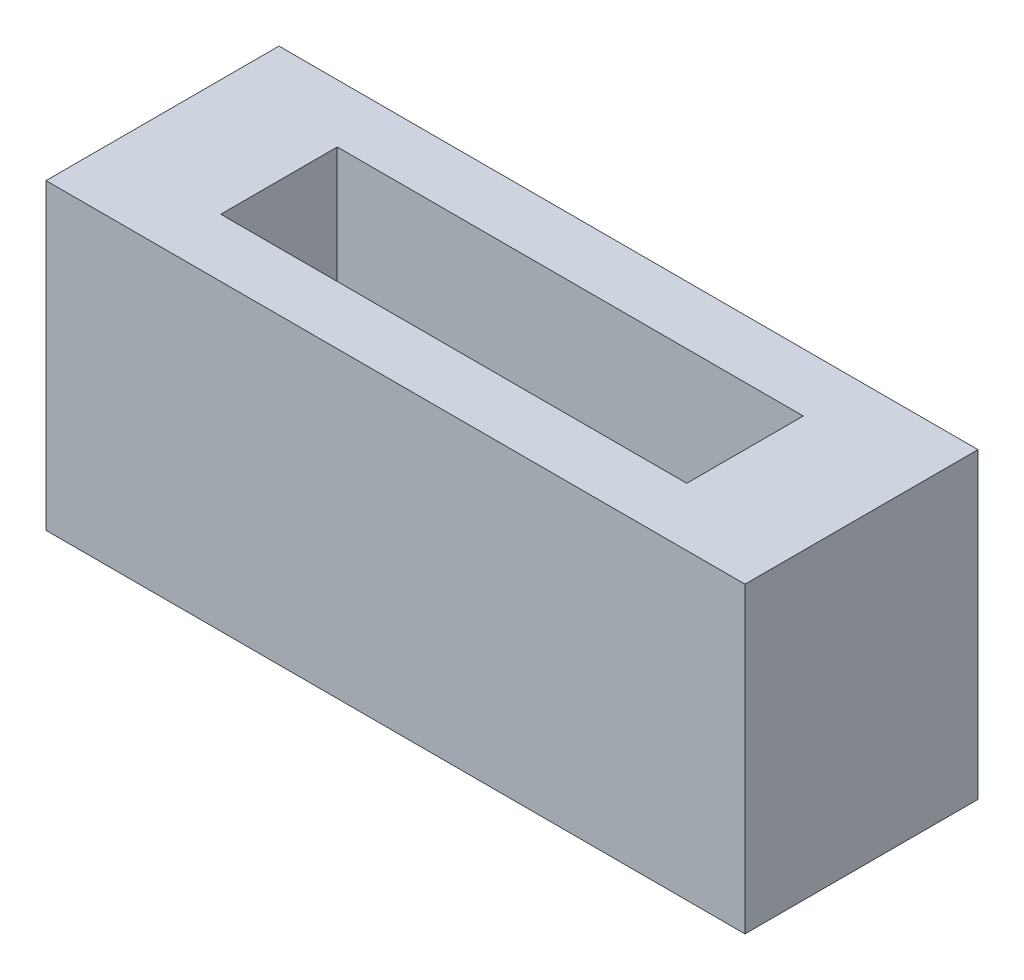
ISO-10303-21;
HEADER;
FILE_DESCRIPTION(('STEP AP214'),'2;1');
FILE_NAME('part.step','',(''),(''),'','','');
FILE_SCHEMA(('AUTOMOTIVE_DESIGN { 1 0 10303 214 1 1 1 1 }'));
ENDSEC;
DATA;
#1=APPLICATION_CONTEXT('core data for automotive mechanical design processes');
#2=APPLICATION_PROTOCOL_DEFINITION('international standard','automotive_design',2000,#1);
#3=PRODUCT_CONTEXT('',#1,'mechanical');
#4=PRODUCT('Part','Part','',(#3));
#5=PRODUCT_RELATED_PRODUCT_CATEGORY('part','',(#4));
#6=PRODUCT_DEFINITION_FORMATION('','',#4);
#7=PRODUCT_DEFINITION_CONTEXT('part definition',#1,'design');
#8=PRODUCT_DEFINITION('design','',#6,#7);
#9=PRODUCT_DEFINITION_SHAPE('','',#8);
#10=(LENGTH_UNIT() NAMED_UNIT(*) SI_UNIT(.MILLI.,.METRE.));
#11=(NAMED_UNIT(*) PLANE_ANGLE_UNIT() SI_UNIT($,.RADIAN.));
#12=(NAMED_UNIT(*) SI_UNIT($,.STERADIAN.) SOLID_ANGLE_UNIT());
#13=UNCERTAINTY_MEASURE_WITH_UNIT(LENGTH_MEASURE(1.E-05),#10,'distance_accuracy_value','');
#14=(GEOMETRIC_REPRESENTATION_CONTEXT(3) GLOBAL_UNCERTAINTY_ASSIGNED_CONTEXT((#13)) GLOBAL_UNIT_ASSIGNED_CONTEXT((#10,
#11,#12)) REPRESENTATION_CONTEXT('',''));
#15=CARTESIAN_POINT('',(0.,0.,0.));
#16=DIRECTION('',(0.,0.,1.));
#17=DIRECTION('',(1.,0.,0.));
#18=AXIS2_PLACEMENT_3D('',#15,#16,#17);
#19=CARTESIAN_POINT('',(19.05,16.51,6.35));
#20=DIRECTION('',(-1.,0.,0.));
#21=DIRECTION('',(0.,0.,1.));
#22=AXIS2_PLACEMENT_3D('',#19,#20,#21);
#23=PLANE('',#22);
#24=DIRECTION('',(0.,0.,-1.));
#25=VECTOR('',#24,1.);
#26=CARTESIAN_POINT('',(19.05,0.,6.35));
#27=LINE('',#26,#25);
#28=CARTESIAN_POINT('',(19.05,0.,6.35));
#29=VERTEX_POINT('',#28);
#30=CARTESIAN_POINT('',(19.05,0.,-6.35));
#31=VERTEX_POINT('',#30);
#32=EDGE_CURVE('E146',#29,#31,#27,.T.);
#33=ORIENTED_EDGE('',*,*,#32,.T.);
#34=DIRECTION('',(0.,-1.,0.));
#35=VECTOR('',#34,1.);
#36=CARTESIAN_POINT('',(19.05,16.51,-6.35));
#37=LINE('',#36,#35);
#38=CARTESIAN_POINT('',(19.05,16.51,-6.35));
#39=VERTEX_POINT('',#38);
#40=EDGE_CURVE('E11',#39,#31,#37,.T.);
#41=ORIENTED_EDGE('',*,*,#40,.F.);
#42=DIRECTION('',(0.,0.,-1.));
#43=VECTOR('',#42,1.);
#44=CARTESIAN_POINT('',(19.05,16.51,6.35));
#45=LINE('',#44,#43);
#46=CARTESIAN_POINT('',(19.05,16.51,6.35));
#47=VERTEX_POINT('',#46);
#48=EDGE_CURVE('E150',#47,#39,#45,.T.);
#49=ORIENTED_EDGE('',*,*,#48,.F.);
#50=DIRECTION('',(0.,-1.,0.));
#51=VECTOR('',#50,1.);
#52=CARTESIAN_POINT('',(19.05,16.51,6.35));
#53=LINE('',#52,#51);
#54=EDGE_CURVE('E156',#47,#29,#53,.T.);
#55=ORIENTED_EDGE('',*,*,#54,.T.);
#56=EDGE_LOOP('',(#33,#41,#49,#55));
#57=FACE_BOUND('',#56,.T.);
#58=ADVANCED_FACE('F38',(#57),#23,.F.);
#59=CARTESIAN_POINT('',(-19.05,16.51,-6.35));
#60=DIRECTION('',(0.,0.,1.));
#61=DIRECTION('',(1.,0.,0.));
#62=AXIS2_PLACEMENT_3D('',#59,#60,#61);
#63=PLANE('',#62);
#64=DIRECTION('',(-1.,0.,0.));
#65=VECTOR('',#64,1.);
#66=CARTESIAN_POINT('',(-19.05,0.,-6.35));
#67=LINE('',#66,#65);
#68=CARTESIAN_POINT('',(-19.05,0.,-6.35));
#69=VERTEX_POINT('',#68);
#70=EDGE_CURVE('E159',#31,#69,#67,.T.);
#71=ORIENTED_EDGE('',*,*,#70,.T.);
#72=DIRECTION('',(0.,-1.,0.));
#73=VECTOR('',#72,1.);
#74=CARTESIAN_POINT('',(-19.05,16.51,-6.35));
#75=LINE('',#74,#73);
#76=CARTESIAN_POINT('',(-19.05,16.51,-6.35));
#77=VERTEX_POINT('',#76);
#78=EDGE_CURVE('E45',#77,#69,#75,.T.);
#79=ORIENTED_EDGE('',*,*,#78,.F.);
#80=DIRECTION('',(-1.,0.,0.));
#81=VECTOR('',#80,1.);
#82=CARTESIAN_POINT('',(-19.05,16.51,-6.35));
#83=LINE('',#82,#81);
#84=EDGE_CURVE('E89',#39,#77,#83,.T.);
#85=ORIENTED_EDGE('',*,*,#84,.F.);
#86=ORIENTED_EDGE('',*,*,#40,.T.);
#87=EDGE_LOOP('',(#71,#79,#85,#86));
#88=FACE_BOUND('',#87,.T.);
#89=ADVANCED_FACE('F188',(#88),#63,.F.);
#90=CARTESIAN_POINT('',(-19.05,16.51,6.35));
#91=DIRECTION('',(1.,0.,0.));
#92=DIRECTION('',(0.,0.,-1.));
#93=AXIS2_PLACEMENT_3D('',#90,#91,#92);
#94=PLANE('',#93);
#95=DIRECTION('',(0.,0.,1.));
#96=VECTOR('',#95,1.);
#97=CARTESIAN_POINT('',(-19.05,0.,6.35));
#98=LINE('',#97,#96);
#99=CARTESIAN_POINT('',(-19.05,0.,6.35));
#100=VERTEX_POINT('',#99);
#101=EDGE_CURVE('E161',#69,#100,#98,.T.);
#102=ORIENTED_EDGE('',*,*,#101,.T.);
#103=DIRECTION('',(0.,-1.,0.));
#104=VECTOR('',#103,1.);
#105=CARTESIAN_POINT('',(-19.05,16.51,6.35));
#106=LINE('',#105,#104);
#107=CARTESIAN_POINT('',(-19.05,16.51,6.35));
#108=VERTEX_POINT('',#107);
#109=EDGE_CURVE('E165',#108,#100,#106,.T.);
#110=ORIENTED_EDGE('',*,*,#109,.F.);
#111=DIRECTION('',(0.,0.,1.));
#112=VECTOR('',#111,1.);
#113=CARTESIAN_POINT('',(-19.05,16.51,6.35));
#114=LINE('',#113,#112);
#115=EDGE_CURVE('E153',#77,#108,#114,.T.);
#116=ORIENTED_EDGE('',*,*,#115,.F.);
#117=ORIENTED_EDGE('',*,*,#78,.T.);
#118=EDGE_LOOP('',(#102,#110,#116,#117));
#119=FACE_BOUND('',#118,.T.);
#120=ADVANCED_FACE('F170',(#119),#94,.F.);
#121=CARTESIAN_POINT('',(-19.05,16.51,6.35));
#122=DIRECTION('',(0.,0.,-1.));
#123=DIRECTION('',(-1.,0.,0.));
#124=AXIS2_PLACEMENT_3D('',#121,#122,#123);
#125=PLANE('',#124);
#126=DIRECTION('',(1.,0.,0.));
#127=VECTOR('',#126,1.);
#128=CARTESIAN_POINT('',(-19.05,0.,6.35));
#129=LINE('',#128,#127);
#130=EDGE_CURVE('E82',#100,#29,#129,.T.);
#131=ORIENTED_EDGE('',*,*,#130,.T.);
#132=ORIENTED_EDGE('',*,*,#54,.F.);
#133=DIRECTION('',(1.,0.,0.));
#134=VECTOR('',#133,1.);
#135=CARTESIAN_POINT('',(-19.05,16.51,6.35));
#136=LINE('',#135,#134);
#137=EDGE_CURVE('E61',#108,#47,#136,.T.);
#138=ORIENTED_EDGE('',*,*,#137,.F.);
#139=ORIENTED_EDGE('',*,*,#109,.T.);
#140=EDGE_LOOP('',(#131,#132,#138,#139));
#141=FACE_BOUND('',#140,.T.);
#142=ADVANCED_FACE('F178',(#141),#125,.F.);
#143=CARTESIAN_POINT('',(0.,16.51,0.));
#144=DIRECTION('',(0.,-1.,0.));
#145=DIRECTION('',(0.,0.,-1.));
#146=AXIS2_PLACEMENT_3D('',#143,#144,#145);
#147=PLANE('',#146);
#148=DIRECTION('',(-1.,0.,0.));
#149=VECTOR('',#148,1.);
#150=CARTESIAN_POINT('',(-12.7,16.51,-3.175));
#151=LINE('',#150,#149);
#152=CARTESIAN_POINT('',(12.7,16.51,-3.175));
#153=VERTEX_POINT('',#152);
#154=CARTESIAN_POINT('',(-12.7,16.51,-3.175));
#155=VERTEX_POINT('',#154);
#156=EDGE_CURVE('E140',#153,#155,#151,.T.);
#157=ORIENTED_EDGE('',*,*,#156,.F.);
#158=DIRECTION('',(0.,0.,-1.));
#159=VECTOR('',#158,1.);
#160=CARTESIAN_POINT('',(12.7,16.51,3.175));
#161=LINE('',#160,#159);
#162=CARTESIAN_POINT('',(12.7,16.51,3.175));
#163=VERTEX_POINT('',#162);
#164=EDGE_CURVE('E52',#163,#153,#161,.T.);
#165=ORIENTED_EDGE('',*,*,#164,.F.);
#166=DIRECTION('',(1.,0.,0.));
#167=VECTOR('',#166,1.);
#168=CARTESIAN_POINT('',(-12.7,16.51,3.175));
#169=LINE('',#168,#167);
#170=CARTESIAN_POINT('',(-12.7,16.51,3.175));
#171=VERTEX_POINT('',#170);
#172=EDGE_CURVE('E131',#171,#163,#169,.T.);
#173=ORIENTED_EDGE('',*,*,#172,.F.);
#174=DIRECTION('',(0.,0.,1.));
#175=VECTOR('',#174,1.);
#176=CARTESIAN_POINT('',(-12.7,16.51,3.175));
#177=LINE('',#176,#175);
#178=EDGE_CURVE('E134',#155,#171,#177,.T.);
#179=ORIENTED_EDGE('',*,*,#178,.F.);
#180=EDGE_LOOP('',(#157,#165,#173,#179));
#181=FACE_BOUND('',#180,.T.);
#182=ORIENTED_EDGE('',*,*,#48,.T.);
#183=ORIENTED_EDGE('',*,*,#84,.T.);
#184=ORIENTED_EDGE('',*,*,#115,.T.);
#185=ORIENTED_EDGE('',*,*,#137,.T.);
#186=EDGE_LOOP('',(#182,#183,#184,#185));
#187=FACE_BOUND('',#186,.T.);
#188=ADVANCED_FACE('F180',(#181,#187),#147,.F.);
#189=CARTESIAN_POINT('',(0.,0.,0.));
#190=DIRECTION('',(0.,-1.,0.));
#191=DIRECTION('',(0.,0.,-1.));
#192=AXIS2_PLACEMENT_3D('',#189,#190,#191);
#193=PLANE('',#192);
#194=ORIENTED_EDGE('',*,*,#32,.F.);
#195=ORIENTED_EDGE('',*,*,#130,.F.);
#196=ORIENTED_EDGE('',*,*,#101,.F.);
#197=ORIENTED_EDGE('',*,*,#70,.F.);
#198=EDGE_LOOP('',(#194,#195,#196,#197));
#199=FACE_BOUND('',#198,.T.);
#200=ADVANCED_FACE('F174',(#199),#193,.T.);
#201=CARTESIAN_POINT('',(12.7,3.81,3.175));
#202=DIRECTION('',(1.,0.,0.));
#203=DIRECTION('',(0.,0.,-1.));
#204=AXIS2_PLACEMENT_3D('',#201,#202,#203);
#205=PLANE('',#204);
#206=ORIENTED_EDGE('',*,*,#164,.T.);
#207=DIRECTION('',(0.,1.,0.));
#208=VECTOR('',#207,1.);
#209=CARTESIAN_POINT('',(12.7,3.81,-3.175));
#210=LINE('',#209,#208);
#211=CARTESIAN_POINT('',(12.7,3.81,-3.175));
#212=VERTEX_POINT('',#211);
#213=EDGE_CURVE('E109',#212,#153,#210,.T.);
#214=ORIENTED_EDGE('',*,*,#213,.F.);
#215=DIRECTION('',(0.,0.,-1.));
#216=VECTOR('',#215,1.);
#217=CARTESIAN_POINT('',(12.7,3.81,3.175));
#218=LINE('',#217,#216);
#219=CARTESIAN_POINT('',(12.7,3.81,3.175));
#220=VERTEX_POINT('',#219);
#221=EDGE_CURVE('E113',#220,#212,#218,.T.);
#222=ORIENTED_EDGE('',*,*,#221,.F.);
#223=DIRECTION('',(0.,1.,0.));
#224=VECTOR('',#223,1.);
#225=CARTESIAN_POINT('',(12.7,3.81,3.175));
#226=LINE('',#225,#224);
#227=EDGE_CURVE('E144',#220,#163,#226,.T.);
#228=ORIENTED_EDGE('',*,*,#227,.T.);
#229=EDGE_LOOP('',(#206,#214,#222,#228));
#230=FACE_BOUND('',#229,.T.);
#231=ADVANCED_FACE('F111',(#230),#205,.F.);
#232=CARTESIAN_POINT('',(-12.7,3.81,3.175));
#233=DIRECTION('',(0.,0.,1.));
#234=DIRECTION('',(1.,0.,0.));
#235=AXIS2_PLACEMENT_3D('',#232,#233,#234);
#236=PLANE('',#235);
#237=ORIENTED_EDGE('',*,*,#172,.T.);
#238=ORIENTED_EDGE('',*,*,#227,.F.);
#239=DIRECTION('',(1.,0.,0.));
#240=VECTOR('',#239,1.);
#241=CARTESIAN_POINT('',(-12.7,3.81,3.175));
#242=LINE('',#241,#240);
#243=CARTESIAN_POINT('',(-12.7,3.81,3.175));
#244=VERTEX_POINT('',#243);
#245=EDGE_CURVE('E119',#244,#220,#242,.T.);
#246=ORIENTED_EDGE('',*,*,#245,.F.);
#247=DIRECTION('',(0.,1.,0.));
#248=VECTOR('',#247,1.);
#249=CARTESIAN_POINT('',(-12.7,3.81,3.175));
#250=LINE('',#249,#248);
#251=EDGE_CURVE('E147',#244,#171,#250,.T.);
#252=ORIENTED_EDGE('',*,*,#251,.T.);
#253=EDGE_LOOP('',(#237,#238,#246,#252));
#254=FACE_BOUND('',#253,.T.);
#255=ADVANCED_FACE('F219',(#254),#236,.F.);
#256=CARTESIAN_POINT('',(-12.7,3.81,3.175));
#257=DIRECTION('',(-1.,0.,0.));
#258=DIRECTION('',(0.,0.,1.));
#259=AXIS2_PLACEMENT_3D('',#256,#257,#258);
#260=PLANE('',#259);
#261=ORIENTED_EDGE('',*,*,#178,.T.);
#262=ORIENTED_EDGE('',*,*,#251,.F.);
#263=DIRECTION('',(0.,0.,1.));
#264=VECTOR('',#263,1.);
#265=CARTESIAN_POINT('',(-12.7,3.81,3.175));
#266=LINE('',#265,#264);
#267=CARTESIAN_POINT('',(-12.7,3.81,-3.175));
#268=VERTEX_POINT('',#267);
#269=EDGE_CURVE('E127',#268,#244,#266,.T.);
#270=ORIENTED_EDGE('',*,*,#269,.F.);
#271=DIRECTION('',(0.,1.,0.));
#272=VECTOR('',#271,1.);
#273=CARTESIAN_POINT('',(-12.7,3.81,-3.175));
#274=LINE('',#273,#272);
#275=EDGE_CURVE('E118',#268,#155,#274,.T.);
#276=ORIENTED_EDGE('',*,*,#275,.T.);
#277=EDGE_LOOP('',(#261,#262,#270,#276));
#278=FACE_BOUND('',#277,.T.);
#279=ADVANCED_FACE('F226',(#278),#260,.F.);
#280=CARTESIAN_POINT('',(-12.7,3.81,-3.175));
#281=DIRECTION('',(0.,0.,-1.));
#282=DIRECTION('',(-1.,0.,0.));
#283=AXIS2_PLACEMENT_3D('',#280,#281,#282);
#284=PLANE('',#283);
#285=ORIENTED_EDGE('',*,*,#156,.T.);
#286=ORIENTED_EDGE('',*,*,#275,.F.);
#287=DIRECTION('',(-1.,0.,0.));
#288=VECTOR('',#287,1.);
#289=CARTESIAN_POINT('',(-12.7,3.81,-3.175));
#290=LINE('',#289,#288);
#291=EDGE_CURVE('E122',#212,#268,#290,.T.);
#292=ORIENTED_EDGE('',*,*,#291,.F.);
#293=ORIENTED_EDGE('',*,*,#213,.T.);
#294=EDGE_LOOP('',(#285,#286,#292,#293));
#295=FACE_BOUND('',#294,.T.);
#296=ADVANCED_FACE('F123',(#295),#284,.F.);
#297=CARTESIAN_POINT('',(0.,3.81,0.));
#298=DIRECTION('',(0.,-1.,0.));
#299=DIRECTION('',(0.,0.,-1.));
#300=AXIS2_PLACEMENT_3D('',#297,#298,#299);
#301=PLANE('',#300);
#302=ORIENTED_EDGE('',*,*,#221,.T.);
#303=ORIENTED_EDGE('',*,*,#291,.T.);
#304=ORIENTED_EDGE('',*,*,#269,.T.);
#305=ORIENTED_EDGE('',*,*,#245,.T.);
#306=EDGE_LOOP('',(#302,#303,#304,#305));
#307=FACE_BOUND('',#306,.T.);
#308=ADVANCED_FACE('F129',(#307),#301,.F.);
#309=CLOSED_SHELL('',(#58,#89,#120,#142,#188,#200,#231,#255,#279,#296,#308));
#310=MANIFOLD_SOLID_BREP('B2',#309);
#311=ADVANCED_BREP_SHAPE_REPRESENTATION('',(#18,#310),#14);
#312=SHAPE_DEFINITION_REPRESENTATION(#9,#311);
ENDSEC;
END-ISO-10303-21;
